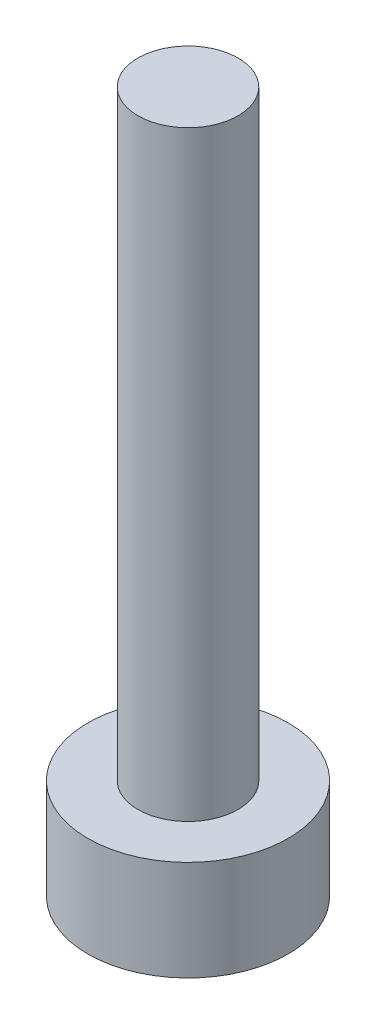
ISO-10303-21;
HEADER;
FILE_DESCRIPTION(('STEP AP214'),'2;1');
FILE_NAME('part.step','',(''),(''),'','','');
FILE_SCHEMA(('AUTOMOTIVE_DESIGN { 1 0 10303 214 1 1 1 1 }'));
ENDSEC;
DATA;
#1=APPLICATION_CONTEXT('core data for automotive mechanical design processes');
#2=APPLICATION_PROTOCOL_DEFINITION('international standard','automotive_design',2000,#1);
#3=PRODUCT_CONTEXT('',#1,'mechanical');
#4=PRODUCT('Part','Part','',(#3));
#5=PRODUCT_RELATED_PRODUCT_CATEGORY('part','',(#4));
#6=PRODUCT_DEFINITION_FORMATION('','',#4);
#7=PRODUCT_DEFINITION_CONTEXT('part definition',#1,'design');
#8=PRODUCT_DEFINITION('design','',#6,#7);
#9=PRODUCT_DEFINITION_SHAPE('','',#8);
#10=(LENGTH_UNIT() NAMED_UNIT(*) SI_UNIT(.MILLI.,.METRE.));
#11=(NAMED_UNIT(*) PLANE_ANGLE_UNIT() SI_UNIT($,.RADIAN.));
#12=(NAMED_UNIT(*) SI_UNIT($,.STERADIAN.) SOLID_ANGLE_UNIT());
#13=UNCERTAINTY_MEASURE_WITH_UNIT(LENGTH_MEASURE(1.E-05),#10,'distance_accuracy_value','');
#14=(GEOMETRIC_REPRESENTATION_CONTEXT(3) GLOBAL_UNCERTAINTY_ASSIGNED_CONTEXT((#13)) GLOBAL_UNIT_ASSIGNED_CONTEXT((#10,
#11,#12)) REPRESENTATION_CONTEXT('',''));
#15=CARTESIAN_POINT('',(0.,0.,0.));
#16=DIRECTION('',(0.,0.,1.));
#17=DIRECTION('',(1.,0.,0.));
#18=AXIS2_PLACEMENT_3D('',#15,#16,#17);
#19=CARTESIAN_POINT('',(0.,5.,0.));
#20=DIRECTION('',(0.,-1.,0.));
#21=DIRECTION('',(0.,0.,-1.));
#22=AXIS2_PLACEMENT_3D('',#19,#20,#21);
#23=CYLINDRICAL_SURFACE('',#22,5.);
#24=CARTESIAN_POINT('',(0.,5.,0.));
#25=DIRECTION('',(0.,1.,0.));
#26=DIRECTION('',(0.,0.,1.));
#27=AXIS2_PLACEMENT_3D('',#24,#25,#26);
#28=CIRCLE('',#27,5.);
#29=CARTESIAN_POINT('',(0.,5.,5.));
#30=VERTEX_POINT('',#29);
#31=EDGE_CURVE('E47',#30,#30,#28,.T.);
#32=ORIENTED_EDGE('',*,*,#31,.F.);
#33=EDGE_LOOP('',(#32));
#34=FACE_BOUND('',#33,.T.);
#35=CARTESIAN_POINT('',(0.,0.,0.));
#36=DIRECTION('',(0.,1.,0.));
#37=DIRECTION('',(0.,0.,1.));
#38=AXIS2_PLACEMENT_3D('',#35,#36,#37);
#39=CIRCLE('',#38,5.);
#40=CARTESIAN_POINT('',(0.,0.,5.));
#41=VERTEX_POINT('',#40);
#42=EDGE_CURVE('E42',#41,#41,#39,.T.);
#43=ORIENTED_EDGE('',*,*,#42,.T.);
#44=EDGE_LOOP('',(#43));
#45=FACE_BOUND('',#44,.T.);
#46=ADVANCED_FACE('F39',(#34,#45),#23,.T.);
#47=CARTESIAN_POINT('',(0.,5.,0.));
#48=DIRECTION('',(0.,1.,0.));
#49=DIRECTION('',(0.,0.,1.));
#50=AXIS2_PLACEMENT_3D('',#47,#48,#49);
#51=PLANE('',#50);
#52=CARTESIAN_POINT('',(0.,5.,0.));
#53=DIRECTION('',(0.,1.,0.));
#54=DIRECTION('',(0.,0.,1.));
#55=AXIS2_PLACEMENT_3D('',#52,#53,#54);
#56=CIRCLE('',#55,2.5);
#57=CARTESIAN_POINT('',(0.,5.,2.5));
#58=VERTEX_POINT('',#57);
#59=EDGE_CURVE('E11',#58,#58,#56,.T.);
#60=ORIENTED_EDGE('',*,*,#59,.F.);
#61=EDGE_LOOP('',(#60));
#62=FACE_BOUND('',#61,.T.);
#63=ORIENTED_EDGE('',*,*,#31,.T.);
#64=EDGE_LOOP('',(#63));
#65=FACE_BOUND('',#64,.T.);
#66=ADVANCED_FACE('F130',(#62,#65),#51,.T.);
#67=CARTESIAN_POINT('',(0.,0.,0.));
#68=DIRECTION('',(0.,1.,0.));
#69=DIRECTION('',(0.,0.,1.));
#70=AXIS2_PLACEMENT_3D('',#67,#68,#69);
#71=PLANE('',#70);
#72=DIRECTION('',(1.,0.,0.));
#73=VECTOR('',#72,1.);
#74=CARTESIAN_POINT('',(-1.03707015001058,0.,-4.12573559678108));
#75=LINE('',#74,#73);
#76=CARTESIAN_POINT('',(-1.03707015001058,0.,-4.12573559678108));
#77=VERTEX_POINT('',#76);
#78=CARTESIAN_POINT('',(1.03707015001058,0.,-4.12573559678108));
#79=VERTEX_POINT('',#78);
#80=EDGE_CURVE('E90',#77,#79,#75,.T.);
#81=ORIENTED_EDGE('',*,*,#80,.F.);
#82=DIRECTION('',(0.,0.,-1.));
#83=VECTOR('',#82,1.);
#84=CARTESIAN_POINT('',(-1.03707015001058,0.,4.10769959417245));
#85=LINE('',#84,#83);
#86=CARTESIAN_POINT('',(-1.03707015001058,0.,4.10769959417245));
#87=VERTEX_POINT('',#86);
#88=EDGE_CURVE('E55',#87,#77,#85,.T.);
#89=ORIENTED_EDGE('',*,*,#88,.F.);
#90=DIRECTION('',(-1.,0.,0.));
#91=VECTOR('',#90,1.);
#92=CARTESIAN_POINT('',(-1.03707015001058,0.,4.10769959417245));
#93=LINE('',#92,#91);
#94=CARTESIAN_POINT('',(1.03707015001058,0.,4.10769959417245));
#95=VERTEX_POINT('',#94);
#96=EDGE_CURVE('E106',#95,#87,#93,.T.);
#97=ORIENTED_EDGE('',*,*,#96,.F.);
#98=DIRECTION('',(0.,0.,1.));
#99=VECTOR('',#98,1.);
#100=CARTESIAN_POINT('',(1.03707015001058,0.,4.10769959417245));
#101=LINE('',#100,#99);
#102=EDGE_CURVE('E112',#79,#95,#101,.T.);
#103=ORIENTED_EDGE('',*,*,#102,.F.);
#104=EDGE_LOOP('',(#81,#89,#97,#103));
#105=FACE_BOUND('',#104,.T.);
#106=ORIENTED_EDGE('',*,*,#42,.F.);
#107=EDGE_LOOP('',(#106));
#108=FACE_BOUND('',#107,.T.);
#109=ADVANCED_FACE('F127',(#105,#108),#71,.F.);
#110=CARTESIAN_POINT('',(0.,35.,0.));
#111=DIRECTION('',(0.,-1.,0.));
#112=DIRECTION('',(0.,0.,-1.));
#113=AXIS2_PLACEMENT_3D('',#110,#111,#112);
#114=CYLINDRICAL_SURFACE('',#113,2.5);
#115=CARTESIAN_POINT('',(0.,35.,0.));
#116=DIRECTION('',(0.,1.,0.));
#117=DIRECTION('',(0.,0.,1.));
#118=AXIS2_PLACEMENT_3D('',#115,#116,#117);
#119=CIRCLE('',#118,2.5);
#120=CARTESIAN_POINT('',(0.,35.,2.5));
#121=VERTEX_POINT('',#120);
#122=EDGE_CURVE('E116',#121,#121,#119,.T.);
#123=ORIENTED_EDGE('',*,*,#122,.F.);
#124=EDGE_LOOP('',(#123));
#125=FACE_BOUND('',#124,.T.);
#126=ORIENTED_EDGE('',*,*,#59,.T.);
#127=EDGE_LOOP('',(#126));
#128=FACE_BOUND('',#127,.T.);
#129=ADVANCED_FACE('F129',(#125,#128),#114,.T.);
#130=CARTESIAN_POINT('',(0.,35.,0.));
#131=DIRECTION('',(0.,1.,0.));
#132=DIRECTION('',(0.,0.,1.));
#133=AXIS2_PLACEMENT_3D('',#130,#131,#132);
#134=PLANE('',#133);
#135=ORIENTED_EDGE('',*,*,#122,.T.);
#136=EDGE_LOOP('',(#135));
#137=FACE_BOUND('',#136,.T.);
#138=ADVANCED_FACE('F136',(#137),#134,.T.);
#139=CARTESIAN_POINT('',(-1.03707015001058,2.,4.10769959417245));
#140=DIRECTION('',(-1.,0.,0.));
#141=DIRECTION('',(0.,0.,1.));
#142=AXIS2_PLACEMENT_3D('',#139,#140,#141);
#143=PLANE('',#142);
#144=ORIENTED_EDGE('',*,*,#88,.T.);
#145=DIRECTION('',(0.,-1.,0.));
#146=VECTOR('',#145,1.);
#147=CARTESIAN_POINT('',(-1.03707015001058,2.,-4.12573559678108));
#148=LINE('',#147,#146);
#149=CARTESIAN_POINT('',(-1.03707015001058,2.,-4.12573559678108));
#150=VERTEX_POINT('',#149);
#151=EDGE_CURVE('E78',#150,#77,#148,.T.);
#152=ORIENTED_EDGE('',*,*,#151,.F.);
#153=DIRECTION('',(0.,0.,-1.));
#154=VECTOR('',#153,1.);
#155=CARTESIAN_POINT('',(-1.03707015001058,2.,4.10769959417245));
#156=LINE('',#155,#154);
#157=CARTESIAN_POINT('',(-1.03707015001058,2.,4.10769959417245));
#158=VERTEX_POINT('',#157);
#159=EDGE_CURVE('E104',#158,#150,#156,.T.);
#160=ORIENTED_EDGE('',*,*,#159,.F.);
#161=DIRECTION('',(0.,-1.,0.));
#162=VECTOR('',#161,1.);
#163=CARTESIAN_POINT('',(-1.03707015001058,2.,4.10769959417245));
#164=LINE('',#163,#162);
#165=EDGE_CURVE('E63',#158,#87,#164,.T.);
#166=ORIENTED_EDGE('',*,*,#165,.T.);
#167=EDGE_LOOP('',(#144,#152,#160,#166));
#168=FACE_BOUND('',#167,.T.);
#169=ADVANCED_FACE('F167',(#168),#143,.F.);
#170=CARTESIAN_POINT('',(-1.03707015001058,2.,4.10769959417245));
#171=DIRECTION('',(0.,0.,1.));
#172=DIRECTION('',(1.,0.,0.));
#173=AXIS2_PLACEMENT_3D('',#170,#171,#172);
#174=PLANE('',#173);
#175=ORIENTED_EDGE('',*,*,#96,.T.);
#176=ORIENTED_EDGE('',*,*,#165,.F.);
#177=DIRECTION('',(-1.,0.,0.));
#178=VECTOR('',#177,1.);
#179=CARTESIAN_POINT('',(-1.03707015001058,2.,4.10769959417245));
#180=LINE('',#179,#178);
#181=CARTESIAN_POINT('',(1.03707015001058,2.,4.10769959417245));
#182=VERTEX_POINT('',#181);
#183=EDGE_CURVE('E101',#182,#158,#180,.T.);
#184=ORIENTED_EDGE('',*,*,#183,.F.);
#185=DIRECTION('',(0.,-1.,0.));
#186=VECTOR('',#185,1.);
#187=CARTESIAN_POINT('',(1.03707015001058,2.,4.10769959417245));
#188=LINE('',#187,#186);
#189=EDGE_CURVE('E94',#182,#95,#188,.T.);
#190=ORIENTED_EDGE('',*,*,#189,.T.);
#191=EDGE_LOOP('',(#175,#176,#184,#190));
#192=FACE_BOUND('',#191,.T.);
#193=ADVANCED_FACE('F183',(#192),#174,.F.);
#194=CARTESIAN_POINT('',(1.03707015001058,2.,4.10769959417245));
#195=DIRECTION('',(1.,0.,0.));
#196=DIRECTION('',(0.,0.,-1.));
#197=AXIS2_PLACEMENT_3D('',#194,#195,#196);
#198=PLANE('',#197);
#199=ORIENTED_EDGE('',*,*,#102,.T.);
#200=ORIENTED_EDGE('',*,*,#189,.F.);
#201=DIRECTION('',(0.,0.,1.));
#202=VECTOR('',#201,1.);
#203=CARTESIAN_POINT('',(1.03707015001058,2.,4.10769959417245));
#204=LINE('',#203,#202);
#205=CARTESIAN_POINT('',(1.03707015001058,2.,-4.12573559678108));
#206=VERTEX_POINT('',#205);
#207=EDGE_CURVE('E97',#206,#182,#204,.T.);
#208=ORIENTED_EDGE('',*,*,#207,.F.);
#209=DIRECTION('',(0.,-1.,0.));
#210=VECTOR('',#209,1.);
#211=CARTESIAN_POINT('',(1.03707015001058,2.,-4.12573559678108));
#212=LINE('',#211,#210);
#213=EDGE_CURVE('E83',#206,#79,#212,.T.);
#214=ORIENTED_EDGE('',*,*,#213,.T.);
#215=EDGE_LOOP('',(#199,#200,#208,#214));
#216=FACE_BOUND('',#215,.T.);
#217=ADVANCED_FACE('F98',(#216),#198,.F.);
#218=CARTESIAN_POINT('',(-1.03707015001058,2.,-4.12573559678108));
#219=DIRECTION('',(0.,0.,-1.));
#220=DIRECTION('',(-1.,0.,0.));
#221=AXIS2_PLACEMENT_3D('',#218,#219,#220);
#222=PLANE('',#221);
#223=ORIENTED_EDGE('',*,*,#80,.T.);
#224=ORIENTED_EDGE('',*,*,#213,.F.);
#225=DIRECTION('',(1.,0.,0.));
#226=VECTOR('',#225,1.);
#227=CARTESIAN_POINT('',(-1.03707015001058,2.,-4.12573559678108));
#228=LINE('',#227,#226);
#229=EDGE_CURVE('E87',#150,#206,#228,.T.);
#230=ORIENTED_EDGE('',*,*,#229,.F.);
#231=ORIENTED_EDGE('',*,*,#151,.T.);
#232=EDGE_LOOP('',(#223,#224,#230,#231));
#233=FACE_BOUND('',#232,.T.);
#234=ADVANCED_FACE('F85',(#233),#222,.F.);
#235=CARTESIAN_POINT('',(0.,2.,0.));
#236=DIRECTION('',(0.,-1.,0.));
#237=DIRECTION('',(0.,0.,-1.));
#238=AXIS2_PLACEMENT_3D('',#235,#236,#237);
#239=PLANE('',#238);
#240=ORIENTED_EDGE('',*,*,#159,.T.);
#241=ORIENTED_EDGE('',*,*,#229,.T.);
#242=ORIENTED_EDGE('',*,*,#207,.T.);
#243=ORIENTED_EDGE('',*,*,#183,.T.);
#244=EDGE_LOOP('',(#240,#241,#242,#243));
#245=FACE_BOUND('',#244,.T.);
#246=ADVANCED_FACE('F103',(#245),#239,.T.);
#247=CLOSED_SHELL('',(#46,#66,#109,#129,#138,#169,#193,#217,#234,#246));
#248=MANIFOLD_SOLID_BREP('B2',#247);
#249=ADVANCED_BREP_SHAPE_REPRESENTATION('',(#18,#248),#14);
#250=SHAPE_DEFINITION_REPRESENTATION(#9,#249);
ENDSEC;
END-ISO-10303-21;
